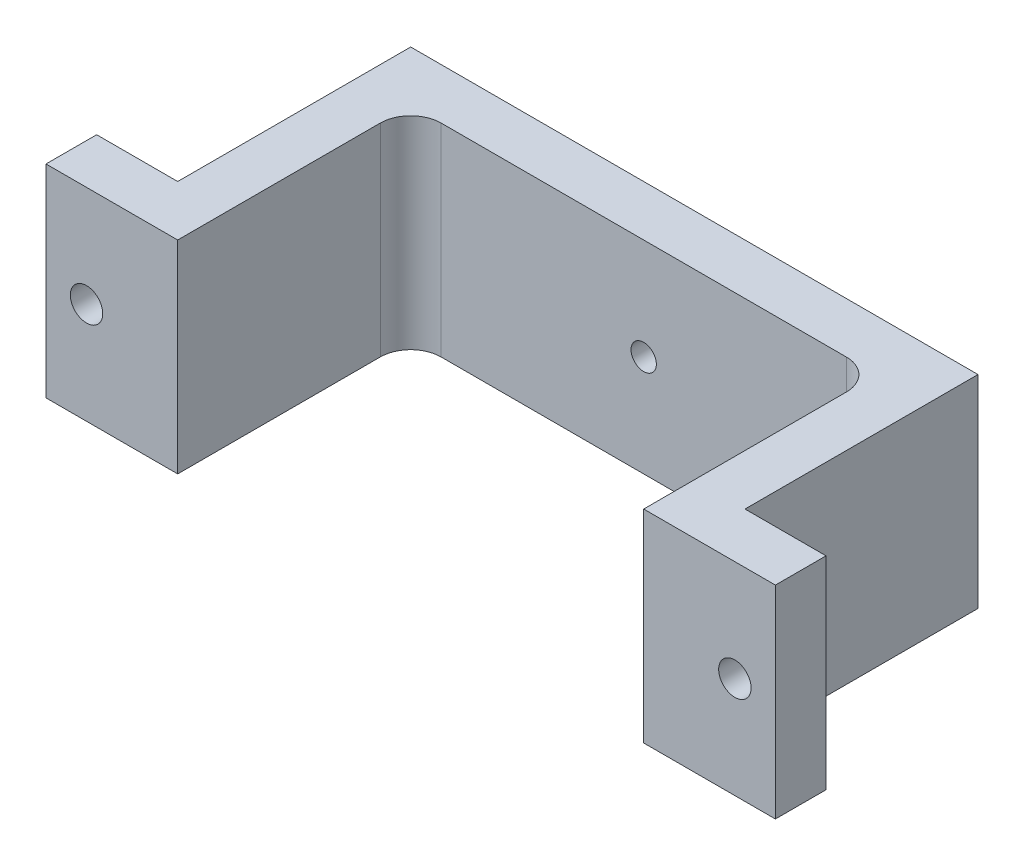
ISO-10303-21;
HEADER;
FILE_DESCRIPTION(('STEP AP214'),'2;1');
FILE_NAME('part.step','',(''),(''),'','','');
FILE_SCHEMA(('AUTOMOTIVE_DESIGN { 1 0 10303 214 1 1 1 1 }'));
ENDSEC;
DATA;
#1=APPLICATION_CONTEXT('core data for automotive mechanical design processes');
#2=APPLICATION_PROTOCOL_DEFINITION('international standard','automotive_design',2000,#1);
#3=PRODUCT_CONTEXT('',#1,'mechanical');
#4=PRODUCT('Part','Part','',(#3));
#5=PRODUCT_RELATED_PRODUCT_CATEGORY('part','',(#4));
#6=PRODUCT_DEFINITION_FORMATION('','',#4);
#7=PRODUCT_DEFINITION_CONTEXT('part definition',#1,'design');
#8=PRODUCT_DEFINITION('design','',#6,#7);
#9=PRODUCT_DEFINITION_SHAPE('','',#8);
#10=(LENGTH_UNIT() NAMED_UNIT(*) SI_UNIT(.MILLI.,.METRE.));
#11=(NAMED_UNIT(*) PLANE_ANGLE_UNIT() SI_UNIT($,.RADIAN.));
#12=(NAMED_UNIT(*) SI_UNIT($,.STERADIAN.) SOLID_ANGLE_UNIT());
#13=UNCERTAINTY_MEASURE_WITH_UNIT(LENGTH_MEASURE(1.E-05),#10,'distance_accuracy_value','');
#14=(GEOMETRIC_REPRESENTATION_CONTEXT(3) GLOBAL_UNCERTAINTY_ASSIGNED_CONTEXT((#13)) GLOBAL_UNIT_ASSIGNED_CONTEXT((#10,
#11,#12)) REPRESENTATION_CONTEXT('',''));
#15=CARTESIAN_POINT('',(0.,0.,0.));
#16=DIRECTION('',(0.,0.,1.));
#17=DIRECTION('',(1.,0.,0.));
#18=AXIS2_PLACEMENT_3D('',#15,#16,#17);
#19=CARTESIAN_POINT('',(23.,20.,15.4715540863816));
#20=DIRECTION('',(1.,0.,0.));
#21=DIRECTION('',(0.,0.,-1.));
#22=AXIS2_PLACEMENT_3D('',#19,#20,#21);
#23=PLANE('',#22);
#24=DIRECTION('',(0.,0.,1.));
#25=VECTOR('',#24,1.);
#26=CARTESIAN_POINT('',(23.,20.,15.4715540863816));
#27=LINE('',#26,#25);
#28=CARTESIAN_POINT('',(23.,20.,-4.52844591361837));
#29=VERTEX_POINT('',#28);
#30=CARTESIAN_POINT('',(23.,20.,15.4715540863816));
#31=VERTEX_POINT('',#30);
#32=EDGE_CURVE('E146',#29,#31,#27,.T.);
#33=ORIENTED_EDGE('',*,*,#32,.F.);
#34=DIRECTION('',(0.,-1.,0.));
#35=VECTOR('',#34,1.);
#36=CARTESIAN_POINT('',(23.,0.,-4.52844591361837));
#37=LINE('',#36,#35);
#38=CARTESIAN_POINT('',(23.,0.,-4.52844591361837));
#39=VERTEX_POINT('',#38);
#40=EDGE_CURVE('E175',#29,#39,#37,.T.);
#41=ORIENTED_EDGE('',*,*,#40,.T.);
#42=DIRECTION('',(0.,0.,1.));
#43=VECTOR('',#42,1.);
#44=CARTESIAN_POINT('',(23.,0.,15.4715540863816));
#45=LINE('',#44,#43);
#46=CARTESIAN_POINT('',(23.,0.,15.4715540863816));
#47=VERTEX_POINT('',#46);
#48=EDGE_CURVE('E172',#39,#47,#45,.T.);
#49=ORIENTED_EDGE('',*,*,#48,.T.);
#50=DIRECTION('',(0.,-1.,0.));
#51=VECTOR('',#50,1.);
#52=CARTESIAN_POINT('',(23.,20.,15.4715540863816));
#53=LINE('',#52,#51);
#54=EDGE_CURVE('E164',#31,#47,#53,.T.);
#55=ORIENTED_EDGE('',*,*,#54,.F.);
#56=EDGE_LOOP('',(#33,#41,#49,#55));
#57=FACE_BOUND('',#56,.T.);
#58=ADVANCED_FACE('F45',(#57),#23,.F.);
#59=CARTESIAN_POINT('',(36.,20.,15.4715540863816));
#60=DIRECTION('',(0.,0.,-1.));
#61=DIRECTION('',(-1.,0.,0.));
#62=AXIS2_PLACEMENT_3D('',#59,#60,#61);
#63=PLANE('',#62);
#64=CARTESIAN_POINT('',(32.,10.,15.4715540863816));
#65=DIRECTION('',(0.,0.,1.));
#66=DIRECTION('',(1.,0.,0.));
#67=AXIS2_PLACEMENT_3D('',#64,#65,#66);
#68=CIRCLE('',#67,1.6);
#69=CARTESIAN_POINT('',(33.6,10.,15.4715540863816));
#70=VERTEX_POINT('',#69);
#71=EDGE_CURVE('E291',#70,#70,#68,.T.);
#72=ORIENTED_EDGE('',*,*,#71,.F.);
#73=EDGE_LOOP('',(#72));
#74=FACE_BOUND('',#73,.T.);
#75=DIRECTION('',(1.,0.,0.));
#76=VECTOR('',#75,1.);
#77=CARTESIAN_POINT('',(36.,0.,15.4715540863816));
#78=LINE('',#77,#76);
#79=CARTESIAN_POINT('',(36.,0.,15.4715540863816));
#80=VERTEX_POINT('',#79);
#81=EDGE_CURVE('E338',#47,#80,#78,.T.);
#82=ORIENTED_EDGE('',*,*,#81,.T.);
#83=DIRECTION('',(0.,-1.,0.));
#84=VECTOR('',#83,1.);
#85=CARTESIAN_POINT('',(36.,20.,15.4715540863816));
#86=LINE('',#85,#84);
#87=CARTESIAN_POINT('',(36.,20.,15.4715540863816));
#88=VERTEX_POINT('',#87);
#89=EDGE_CURVE('E166',#88,#80,#86,.T.);
#90=ORIENTED_EDGE('',*,*,#89,.F.);
#91=DIRECTION('',(1.,0.,0.));
#92=VECTOR('',#91,1.);
#93=CARTESIAN_POINT('',(36.,20.,15.4715540863816));
#94=LINE('',#93,#92);
#95=EDGE_CURVE('E150',#31,#88,#94,.T.);
#96=ORIENTED_EDGE('',*,*,#95,.F.);
#97=ORIENTED_EDGE('',*,*,#54,.T.);
#98=EDGE_LOOP('',(#82,#90,#96,#97));
#99=FACE_BOUND('',#98,.T.);
#100=ADVANCED_FACE('F163',(#74,#99),#63,.F.);
#101=CARTESIAN_POINT('',(36.,20.,10.4715540863816));
#102=DIRECTION('',(-1.,0.,0.));
#103=DIRECTION('',(0.,0.,1.));
#104=AXIS2_PLACEMENT_3D('',#101,#102,#103);
#105=PLANE('',#104);
#106=DIRECTION('',(0.,0.,-1.));
#107=VECTOR('',#106,1.);
#108=CARTESIAN_POINT('',(36.,0.,10.4715540863816));
#109=LINE('',#108,#107);
#110=CARTESIAN_POINT('',(36.,0.,10.4715540863816));
#111=VERTEX_POINT('',#110);
#112=EDGE_CURVE('E341',#80,#111,#109,.T.);
#113=ORIENTED_EDGE('',*,*,#112,.T.);
#114=DIRECTION('',(0.,-1.,0.));
#115=VECTOR('',#114,1.);
#116=CARTESIAN_POINT('',(36.,20.,10.4715540863816));
#117=LINE('',#116,#115);
#118=CARTESIAN_POINT('',(36.,20.,10.4715540863816));
#119=VERTEX_POINT('',#118);
#120=EDGE_CURVE('E181',#119,#111,#117,.T.);
#121=ORIENTED_EDGE('',*,*,#120,.F.);
#122=DIRECTION('',(0.,0.,-1.));
#123=VECTOR('',#122,1.);
#124=CARTESIAN_POINT('',(36.,20.,10.4715540863816));
#125=LINE('',#124,#123);
#126=EDGE_CURVE('E169',#88,#119,#125,.T.);
#127=ORIENTED_EDGE('',*,*,#126,.F.);
#128=ORIENTED_EDGE('',*,*,#89,.T.);
#129=EDGE_LOOP('',(#113,#121,#127,#128));
#130=FACE_BOUND('',#129,.T.);
#131=ADVANCED_FACE('F225',(#130),#105,.F.);
#132=CARTESIAN_POINT('',(28.,20.,10.4715540863816));
#133=DIRECTION('',(0.,0.,1.));
#134=DIRECTION('',(1.,0.,0.));
#135=AXIS2_PLACEMENT_3D('',#132,#133,#134);
#136=PLANE('',#135);
#137=CARTESIAN_POINT('',(32.,10.,10.4715540863816));
#138=DIRECTION('',(0.,0.,1.));
#139=DIRECTION('',(1.,0.,0.));
#140=AXIS2_PLACEMENT_3D('',#137,#138,#139);
#141=CIRCLE('',#140,1.6);
#142=CARTESIAN_POINT('',(33.6,10.,10.4715540863816));
#143=VERTEX_POINT('',#142);
#144=EDGE_CURVE('E286',#143,#143,#141,.F.);
#145=ORIENTED_EDGE('',*,*,#144,.F.);
#146=EDGE_LOOP('',(#145));
#147=FACE_BOUND('',#146,.T.);
#148=DIRECTION('',(-1.,0.,0.));
#149=VECTOR('',#148,1.);
#150=CARTESIAN_POINT('',(28.,0.,10.4715540863816));
#151=LINE('',#150,#149);
#152=CARTESIAN_POINT('',(28.,0.,10.4715540863816));
#153=VERTEX_POINT('',#152);
#154=EDGE_CURVE('E344',#111,#153,#151,.T.);
#155=ORIENTED_EDGE('',*,*,#154,.T.);
#156=DIRECTION('',(0.,-1.,0.));
#157=VECTOR('',#156,1.);
#158=CARTESIAN_POINT('',(28.,20.,10.4715540863816));
#159=LINE('',#158,#157);
#160=CARTESIAN_POINT('',(28.,20.,10.4715540863816));
#161=VERTEX_POINT('',#160);
#162=EDGE_CURVE('E390',#161,#153,#159,.T.);
#163=ORIENTED_EDGE('',*,*,#162,.F.);
#164=DIRECTION('',(-1.,0.,0.));
#165=VECTOR('',#164,1.);
#166=CARTESIAN_POINT('',(28.,20.,10.4715540863816));
#167=LINE('',#166,#165);
#168=EDGE_CURVE('E308',#119,#161,#167,.T.);
#169=ORIENTED_EDGE('',*,*,#168,.F.);
#170=ORIENTED_EDGE('',*,*,#120,.T.);
#171=EDGE_LOOP('',(#155,#163,#169,#170));
#172=FACE_BOUND('',#171,.T.);
#173=ADVANCED_FACE('F231',(#147,#172),#136,.F.);
#174=CARTESIAN_POINT('',(28.,20.,-12.5284459136184));
#175=DIRECTION('',(-1.,0.,0.));
#176=DIRECTION('',(0.,0.,1.));
#177=AXIS2_PLACEMENT_3D('',#174,#175,#176);
#178=PLANE('',#177);
#179=DIRECTION('',(0.,0.,-1.));
#180=VECTOR('',#179,1.);
#181=CARTESIAN_POINT('',(28.,0.,-12.5284459136184));
#182=LINE('',#181,#180);
#183=CARTESIAN_POINT('',(28.,0.,-12.5284459136184));
#184=VERTEX_POINT('',#183);
#185=EDGE_CURVE('E347',#153,#184,#182,.T.);
#186=ORIENTED_EDGE('',*,*,#185,.T.);
#187=DIRECTION('',(0.,-1.,0.));
#188=VECTOR('',#187,1.);
#189=CARTESIAN_POINT('',(28.,20.,-12.5284459136184));
#190=LINE('',#189,#188);
#191=CARTESIAN_POINT('',(28.,20.,-12.5284459136184));
#192=VERTEX_POINT('',#191);
#193=EDGE_CURVE('E386',#192,#184,#190,.T.);
#194=ORIENTED_EDGE('',*,*,#193,.F.);
#195=DIRECTION('',(0.,0.,-1.));
#196=VECTOR('',#195,1.);
#197=CARTESIAN_POINT('',(28.,20.,-12.5284459136184));
#198=LINE('',#197,#196);
#199=EDGE_CURVE('E311',#161,#192,#198,.T.);
#200=ORIENTED_EDGE('',*,*,#199,.F.);
#201=ORIENTED_EDGE('',*,*,#162,.T.);
#202=EDGE_LOOP('',(#186,#194,#200,#201));
#203=FACE_BOUND('',#202,.T.);
#204=ADVANCED_FACE('F235',(#203),#178,.F.);
#205=CARTESIAN_POINT('',(28.,20.,-12.5284459136184));
#206=DIRECTION('',(0.,0.,1.));
#207=DIRECTION('',(1.,0.,0.));
#208=AXIS2_PLACEMENT_3D('',#205,#206,#207);
#209=PLANE('',#208);
#210=CARTESIAN_POINT('',(0.,10.,-12.5284459136184));
#211=DIRECTION('',(0.,0.,-1.));
#212=DIRECTION('',(-1.,0.,0.));
#213=AXIS2_PLACEMENT_3D('',#210,#211,#212);
#214=CIRCLE('',#213,1.25);
#215=CARTESIAN_POINT('',(-1.25,10.,-12.5284459136184));
#216=VERTEX_POINT('',#215);
#217=EDGE_CURVE('E281',#216,#216,#214,.T.);
#218=ORIENTED_EDGE('',*,*,#217,.F.);
#219=EDGE_LOOP('',(#218));
#220=FACE_BOUND('',#219,.T.);
#221=DIRECTION('',(-1.,0.,0.));
#222=VECTOR('',#221,1.);
#223=CARTESIAN_POINT('',(28.,0.,-12.5284459136184));
#224=LINE('',#223,#222);
#225=CARTESIAN_POINT('',(-28.,0.,-12.5284459136184));
#226=VERTEX_POINT('',#225);
#227=EDGE_CURVE('E350',#184,#226,#224,.T.);
#228=ORIENTED_EDGE('',*,*,#227,.T.);
#229=DIRECTION('',(0.,-1.,0.));
#230=VECTOR('',#229,1.);
#231=CARTESIAN_POINT('',(-28.,20.,-12.5284459136184));
#232=LINE('',#231,#230);
#233=CARTESIAN_POINT('',(-28.,20.,-12.5284459136184));
#234=VERTEX_POINT('',#233);
#235=EDGE_CURVE('E382',#234,#226,#232,.T.);
#236=ORIENTED_EDGE('',*,*,#235,.F.);
#237=DIRECTION('',(-1.,0.,0.));
#238=VECTOR('',#237,1.);
#239=CARTESIAN_POINT('',(28.,20.,-12.5284459136184));
#240=LINE('',#239,#238);
#241=EDGE_CURVE('E314',#192,#234,#240,.T.);
#242=ORIENTED_EDGE('',*,*,#241,.F.);
#243=ORIENTED_EDGE('',*,*,#193,.T.);
#244=EDGE_LOOP('',(#228,#236,#242,#243));
#245=FACE_BOUND('',#244,.T.);
#246=ADVANCED_FACE('F239',(#220,#245),#209,.F.);
#247=CARTESIAN_POINT('',(-28.,20.,-12.5284459136184));
#248=DIRECTION('',(1.,0.,0.));
#249=DIRECTION('',(0.,0.,-1.));
#250=AXIS2_PLACEMENT_3D('',#247,#248,#249);
#251=PLANE('',#250);
#252=DIRECTION('',(0.,0.,1.));
#253=VECTOR('',#252,1.);
#254=CARTESIAN_POINT('',(-28.,0.,-12.5284459136184));
#255=LINE('',#254,#253);
#256=CARTESIAN_POINT('',(-28.,0.,10.4715540863816));
#257=VERTEX_POINT('',#256);
#258=EDGE_CURVE('E353',#226,#257,#255,.T.);
#259=ORIENTED_EDGE('',*,*,#258,.T.);
#260=DIRECTION('',(0.,-1.,0.));
#261=VECTOR('',#260,1.);
#262=CARTESIAN_POINT('',(-28.,20.,10.4715540863816));
#263=LINE('',#262,#261);
#264=CARTESIAN_POINT('',(-28.,20.,10.4715540863816));
#265=VERTEX_POINT('',#264);
#266=EDGE_CURVE('E378',#265,#257,#263,.T.);
#267=ORIENTED_EDGE('',*,*,#266,.F.);
#268=DIRECTION('',(0.,0.,1.));
#269=VECTOR('',#268,1.);
#270=CARTESIAN_POINT('',(-28.,20.,-12.5284459136184));
#271=LINE('',#270,#269);
#272=EDGE_CURVE('E317',#234,#265,#271,.T.);
#273=ORIENTED_EDGE('',*,*,#272,.F.);
#274=ORIENTED_EDGE('',*,*,#235,.T.);
#275=EDGE_LOOP('',(#259,#267,#273,#274));
#276=FACE_BOUND('',#275,.T.);
#277=ADVANCED_FACE('F243',(#276),#251,.F.);
#278=CARTESIAN_POINT('',(-28.,20.,10.4715540863816));
#279=DIRECTION('',(0.,0.,1.));
#280=DIRECTION('',(1.,0.,0.));
#281=AXIS2_PLACEMENT_3D('',#278,#279,#280);
#282=PLANE('',#281);
#283=CARTESIAN_POINT('',(-32.,10.,10.4715540863816));
#284=DIRECTION('',(0.,0.,1.));
#285=DIRECTION('',(1.,0.,0.));
#286=AXIS2_PLACEMENT_3D('',#283,#284,#285);
#287=CIRCLE('',#286,1.6);
#288=CARTESIAN_POINT('',(-30.4,10.,10.4715540863816));
#289=VERTEX_POINT('',#288);
#290=EDGE_CURVE('E299',#289,#289,#287,.F.);
#291=ORIENTED_EDGE('',*,*,#290,.F.);
#292=EDGE_LOOP('',(#291));
#293=FACE_BOUND('',#292,.T.);
#294=DIRECTION('',(-1.,0.,0.));
#295=VECTOR('',#294,1.);
#296=CARTESIAN_POINT('',(-28.,0.,10.4715540863816));
#297=LINE('',#296,#295);
#298=CARTESIAN_POINT('',(-36.,0.,10.4715540863816));
#299=VERTEX_POINT('',#298);
#300=EDGE_CURVE('E356',#257,#299,#297,.T.);
#301=ORIENTED_EDGE('',*,*,#300,.T.);
#302=DIRECTION('',(0.,-1.,0.));
#303=VECTOR('',#302,1.);
#304=CARTESIAN_POINT('',(-36.,20.,10.4715540863816));
#305=LINE('',#304,#303);
#306=CARTESIAN_POINT('',(-36.,20.,10.4715540863816));
#307=VERTEX_POINT('',#306);
#308=EDGE_CURVE('E374',#307,#299,#305,.T.);
#309=ORIENTED_EDGE('',*,*,#308,.F.);
#310=DIRECTION('',(-1.,0.,0.));
#311=VECTOR('',#310,1.);
#312=CARTESIAN_POINT('',(-28.,20.,10.4715540863816));
#313=LINE('',#312,#311);
#314=EDGE_CURVE('E320',#265,#307,#313,.T.);
#315=ORIENTED_EDGE('',*,*,#314,.F.);
#316=ORIENTED_EDGE('',*,*,#266,.T.);
#317=EDGE_LOOP('',(#301,#309,#315,#316));
#318=FACE_BOUND('',#317,.T.);
#319=ADVANCED_FACE('F247',(#293,#318),#282,.F.);
#320=CARTESIAN_POINT('',(-36.,20.,10.4715540863816));
#321=DIRECTION('',(1.,0.,0.));
#322=DIRECTION('',(0.,0.,-1.));
#323=AXIS2_PLACEMENT_3D('',#320,#321,#322);
#324=PLANE('',#323);
#325=DIRECTION('',(0.,0.,1.));
#326=VECTOR('',#325,1.);
#327=CARTESIAN_POINT('',(-36.,0.,10.4715540863816));
#328=LINE('',#327,#326);
#329=CARTESIAN_POINT('',(-36.,0.,15.4715540863816));
#330=VERTEX_POINT('',#329);
#331=EDGE_CURVE('E359',#299,#330,#328,.T.);
#332=ORIENTED_EDGE('',*,*,#331,.T.);
#333=DIRECTION('',(0.,-1.,0.));
#334=VECTOR('',#333,1.);
#335=CARTESIAN_POINT('',(-36.,20.,15.4715540863816));
#336=LINE('',#335,#334);
#337=CARTESIAN_POINT('',(-36.,20.,15.4715540863816));
#338=VERTEX_POINT('',#337);
#339=EDGE_CURVE('E370',#338,#330,#336,.T.);
#340=ORIENTED_EDGE('',*,*,#339,.F.);
#341=DIRECTION('',(0.,0.,1.));
#342=VECTOR('',#341,1.);
#343=CARTESIAN_POINT('',(-36.,20.,10.4715540863816));
#344=LINE('',#343,#342);
#345=EDGE_CURVE('E323',#307,#338,#344,.T.);
#346=ORIENTED_EDGE('',*,*,#345,.F.);
#347=ORIENTED_EDGE('',*,*,#308,.T.);
#348=EDGE_LOOP('',(#332,#340,#346,#347));
#349=FACE_BOUND('',#348,.T.);
#350=ADVANCED_FACE('F251',(#349),#324,.F.);
#351=CARTESIAN_POINT('',(-36.,20.,15.4715540863816));
#352=DIRECTION('',(0.,0.,-1.));
#353=DIRECTION('',(-1.,0.,0.));
#354=AXIS2_PLACEMENT_3D('',#351,#352,#353);
#355=PLANE('',#354);
#356=CARTESIAN_POINT('',(-32.,10.,15.4715540863816));
#357=DIRECTION('',(0.,0.,1.));
#358=DIRECTION('',(1.,0.,0.));
#359=AXIS2_PLACEMENT_3D('',#356,#357,#358);
#360=CIRCLE('',#359,1.6);
#361=CARTESIAN_POINT('',(-30.4,10.,15.4715540863816));
#362=VERTEX_POINT('',#361);
#363=EDGE_CURVE('E295',#362,#362,#360,.T.);
#364=ORIENTED_EDGE('',*,*,#363,.F.);
#365=EDGE_LOOP('',(#364));
#366=FACE_BOUND('',#365,.T.);
#367=DIRECTION('',(1.,0.,0.));
#368=VECTOR('',#367,1.);
#369=CARTESIAN_POINT('',(-36.,0.,15.4715540863816));
#370=LINE('',#369,#368);
#371=CARTESIAN_POINT('',(-23.,0.,15.4715540863816));
#372=VERTEX_POINT('',#371);
#373=EDGE_CURVE('E362',#330,#372,#370,.T.);
#374=ORIENTED_EDGE('',*,*,#373,.T.);
#375=DIRECTION('',(0.,-1.,0.));
#376=VECTOR('',#375,1.);
#377=CARTESIAN_POINT('',(-23.,20.,15.4715540863816));
#378=LINE('',#377,#376);
#379=CARTESIAN_POINT('',(-23.,20.,15.4715540863816));
#380=VERTEX_POINT('',#379);
#381=EDGE_CURVE('E335',#380,#372,#378,.T.);
#382=ORIENTED_EDGE('',*,*,#381,.F.);
#383=DIRECTION('',(1.,0.,0.));
#384=VECTOR('',#383,1.);
#385=CARTESIAN_POINT('',(-36.,20.,15.4715540863816));
#386=LINE('',#385,#384);
#387=EDGE_CURVE('E326',#338,#380,#386,.T.);
#388=ORIENTED_EDGE('',*,*,#387,.F.);
#389=ORIENTED_EDGE('',*,*,#339,.T.);
#390=EDGE_LOOP('',(#374,#382,#388,#389));
#391=FACE_BOUND('',#390,.T.);
#392=ADVANCED_FACE('F254',(#366,#391),#355,.F.);
#393=CARTESIAN_POINT('',(-23.,20.,15.4715540863816));
#394=DIRECTION('',(-1.,0.,0.));
#395=DIRECTION('',(0.,0.,1.));
#396=AXIS2_PLACEMENT_3D('',#393,#394,#395);
#397=PLANE('',#396);
#398=DIRECTION('',(0.,0.,-1.));
#399=VECTOR('',#398,1.);
#400=CARTESIAN_POINT('',(-23.,0.,15.4715540863816));
#401=LINE('',#400,#399);
#402=CARTESIAN_POINT('',(-23.,0.,-4.52844591361837));
#403=VERTEX_POINT('',#402);
#404=EDGE_CURVE('E207',#372,#403,#401,.T.);
#405=ORIENTED_EDGE('',*,*,#404,.T.);
#406=DIRECTION('',(0.,-1.,0.));
#407=VECTOR('',#406,1.);
#408=CARTESIAN_POINT('',(-23.,20.,-4.52844591361837));
#409=LINE('',#408,#407);
#410=CARTESIAN_POINT('',(-23.,20.,-4.52844591361837));
#411=VERTEX_POINT('',#410);
#412=EDGE_CURVE('E61',#403,#411,#409,.F.);
#413=ORIENTED_EDGE('',*,*,#412,.T.);
#414=DIRECTION('',(0.,0.,-1.));
#415=VECTOR('',#414,1.);
#416=CARTESIAN_POINT('',(-23.,20.,15.4715540863816));
#417=LINE('',#416,#415);
#418=EDGE_CURVE('E329',#380,#411,#417,.T.);
#419=ORIENTED_EDGE('',*,*,#418,.F.);
#420=ORIENTED_EDGE('',*,*,#381,.T.);
#421=EDGE_LOOP('',(#405,#413,#419,#420));
#422=FACE_BOUND('',#421,.T.);
#423=ADVANCED_FACE('F258',(#422),#397,.F.);
#424=CARTESIAN_POINT('',(-23.,20.,-7.52844591361837));
#425=DIRECTION('',(0.,0.,-1.));
#426=DIRECTION('',(-1.,0.,0.));
#427=AXIS2_PLACEMENT_3D('',#424,#425,#426);
#428=PLANE('',#427);
#429=CARTESIAN_POINT('',(0.,10.,-7.52844591361837));
#430=DIRECTION('',(0.,0.,-1.));
#431=DIRECTION('',(-1.,0.,0.));
#432=AXIS2_PLACEMENT_3D('',#429,#430,#431);
#433=CIRCLE('',#432,1.25);
#434=CARTESIAN_POINT('',(-1.25,10.,-7.52844591361837));
#435=VERTEX_POINT('',#434);
#436=EDGE_CURVE('E284',#435,#435,#433,.F.);
#437=ORIENTED_EDGE('',*,*,#436,.F.);
#438=EDGE_LOOP('',(#437));
#439=FACE_BOUND('',#438,.T.);
#440=DIRECTION('',(1.,0.,0.));
#441=VECTOR('',#440,1.);
#442=CARTESIAN_POINT('',(-23.,0.,-7.52844591361837));
#443=LINE('',#442,#441);
#444=CARTESIAN_POINT('',(-20.,0.,-7.52844591361837));
#445=VERTEX_POINT('',#444);
#446=CARTESIAN_POINT('',(20.,0.,-7.52844591361837));
#447=VERTEX_POINT('',#446);
#448=EDGE_CURVE('E159',#445,#447,#443,.T.);
#449=ORIENTED_EDGE('',*,*,#448,.T.);
#450=DIRECTION('',(0.,-1.,0.));
#451=VECTOR('',#450,1.);
#452=CARTESIAN_POINT('',(20.,20.,-7.52844591361837));
#453=LINE('',#452,#451);
#454=CARTESIAN_POINT('',(20.,20.,-7.52844591361837));
#455=VERTEX_POINT('',#454);
#456=EDGE_CURVE('E188',#447,#455,#453,.F.);
#457=ORIENTED_EDGE('',*,*,#456,.T.);
#458=DIRECTION('',(1.,0.,0.));
#459=VECTOR('',#458,1.);
#460=CARTESIAN_POINT('',(-23.,20.,-7.52844591361837));
#461=LINE('',#460,#459);
#462=CARTESIAN_POINT('',(-20.,20.,-7.52844591361837));
#463=VERTEX_POINT('',#462);
#464=EDGE_CURVE('E332',#463,#455,#461,.T.);
#465=ORIENTED_EDGE('',*,*,#464,.F.);
#466=DIRECTION('',(0.,-1.,0.));
#467=VECTOR('',#466,1.);
#468=CARTESIAN_POINT('',(-20.,0.,-7.52844591361837));
#469=LINE('',#468,#467);
#470=EDGE_CURVE('E179',#463,#445,#469,.T.);
#471=ORIENTED_EDGE('',*,*,#470,.T.);
#472=EDGE_LOOP('',(#449,#457,#465,#471));
#473=FACE_BOUND('',#472,.T.);
#474=ADVANCED_FACE('F203',(#439,#473),#428,.F.);
#475=CARTESIAN_POINT('',(0.,20.,0.));
#476=DIRECTION('',(0.,-1.,0.));
#477=DIRECTION('',(0.,0.,-1.));
#478=AXIS2_PLACEMENT_3D('',#475,#476,#477);
#479=PLANE('',#478);
#480=ORIENTED_EDGE('',*,*,#464,.T.);
#481=CARTESIAN_POINT('',(20.,20.,-4.52844591361837));
#482=DIRECTION('',(0.,-1.,0.));
#483=DIRECTION('',(0.,0.,-1.));
#484=AXIS2_PLACEMENT_3D('',#481,#482,#483);
#485=CIRCLE('',#484,3.);
#486=EDGE_CURVE('E153',#455,#29,#485,.T.);
#487=ORIENTED_EDGE('',*,*,#486,.T.);
#488=ORIENTED_EDGE('',*,*,#32,.T.);
#489=ORIENTED_EDGE('',*,*,#95,.T.);
#490=ORIENTED_EDGE('',*,*,#126,.T.);
#491=ORIENTED_EDGE('',*,*,#168,.T.);
#492=ORIENTED_EDGE('',*,*,#199,.T.);
#493=ORIENTED_EDGE('',*,*,#241,.T.);
#494=ORIENTED_EDGE('',*,*,#272,.T.);
#495=ORIENTED_EDGE('',*,*,#314,.T.);
#496=ORIENTED_EDGE('',*,*,#345,.T.);
#497=ORIENTED_EDGE('',*,*,#387,.T.);
#498=ORIENTED_EDGE('',*,*,#418,.T.);
#499=CARTESIAN_POINT('',(-20.,20.,-4.52844591361837));
#500=DIRECTION('',(0.,-1.,0.));
#501=DIRECTION('',(0.,0.,-1.));
#502=AXIS2_PLACEMENT_3D('',#499,#500,#501);
#503=CIRCLE('',#502,3.);
#504=EDGE_CURVE('E11',#411,#463,#503,.T.);
#505=ORIENTED_EDGE('',*,*,#504,.T.);
#506=EDGE_LOOP('',(#480,#487,#488,#489,#490,#491,#492,#493,#494,#495,#496,#497,#498,#505));
#507=FACE_BOUND('',#506,.T.);
#508=ADVANCED_FACE('F149',(#507),#479,.F.);
#509=CARTESIAN_POINT('',(0.,0.,0.));
#510=DIRECTION('',(0.,-1.,0.));
#511=DIRECTION('',(0.,0.,-1.));
#512=AXIS2_PLACEMENT_3D('',#509,#510,#511);
#513=PLANE('',#512);
#514=ORIENTED_EDGE('',*,*,#48,.F.);
#515=CARTESIAN_POINT('',(20.,0.,-4.52844591361837));
#516=DIRECTION('',(0.,-1.,0.));
#517=DIRECTION('',(0.,0.,-1.));
#518=AXIS2_PLACEMENT_3D('',#515,#516,#517);
#519=CIRCLE('',#518,3.);
#520=EDGE_CURVE('E193',#39,#447,#519,.F.);
#521=ORIENTED_EDGE('',*,*,#520,.T.);
#522=ORIENTED_EDGE('',*,*,#448,.F.);
#523=CARTESIAN_POINT('',(-20.,0.,-4.52844591361837));
#524=DIRECTION('',(0.,-1.,0.));
#525=DIRECTION('',(0.,0.,-1.));
#526=AXIS2_PLACEMENT_3D('',#523,#524,#525);
#527=CIRCLE('',#526,3.);
#528=EDGE_CURVE('E54',#445,#403,#527,.F.);
#529=ORIENTED_EDGE('',*,*,#528,.T.);
#530=ORIENTED_EDGE('',*,*,#404,.F.);
#531=ORIENTED_EDGE('',*,*,#373,.F.);
#532=ORIENTED_EDGE('',*,*,#331,.F.);
#533=ORIENTED_EDGE('',*,*,#300,.F.);
#534=ORIENTED_EDGE('',*,*,#258,.F.);
#535=ORIENTED_EDGE('',*,*,#227,.F.);
#536=ORIENTED_EDGE('',*,*,#185,.F.);
#537=ORIENTED_EDGE('',*,*,#154,.F.);
#538=ORIENTED_EDGE('',*,*,#112,.F.);
#539=ORIENTED_EDGE('',*,*,#81,.F.);
#540=EDGE_LOOP('',(#514,#521,#522,#529,#530,#531,#532,#533,#534,#535,#536,#537,#538,#539));
#541=FACE_BOUND('',#540,.T.);
#542=ADVANCED_FACE('F199',(#541),#513,.T.);
#543=CARTESIAN_POINT('',(20.,20.,-4.52844591361837));
#544=DIRECTION('',(0.,1.,0.));
#545=DIRECTION('',(0.,0.,1.));
#546=AXIS2_PLACEMENT_3D('',#543,#544,#545);
#547=CYLINDRICAL_SURFACE('',#546,3.);
#548=ORIENTED_EDGE('',*,*,#486,.F.);
#549=ORIENTED_EDGE('',*,*,#456,.F.);
#550=ORIENTED_EDGE('',*,*,#520,.F.);
#551=ORIENTED_EDGE('',*,*,#40,.F.);
#552=EDGE_LOOP('',(#548,#549,#550,#551));
#553=FACE_BOUND('',#552,.T.);
#554=ADVANCED_FACE('F209',(#553),#547,.F.);
#555=CARTESIAN_POINT('',(-20.,20.,-4.52844591361837));
#556=DIRECTION('',(0.,1.,0.));
#557=DIRECTION('',(0.,0.,1.));
#558=AXIS2_PLACEMENT_3D('',#555,#556,#557);
#559=CYLINDRICAL_SURFACE('',#558,3.);
#560=ORIENTED_EDGE('',*,*,#504,.F.);
#561=ORIENTED_EDGE('',*,*,#412,.F.);
#562=ORIENTED_EDGE('',*,*,#528,.F.);
#563=ORIENTED_EDGE('',*,*,#470,.F.);
#564=EDGE_LOOP('',(#560,#561,#562,#563));
#565=FACE_BOUND('',#564,.T.);
#566=ADVANCED_FACE('F47',(#565),#559,.F.);
#567=CARTESIAN_POINT('',(-32.,10.,-12.5294459136184));
#568=DIRECTION('',(0.,0.,1.));
#569=DIRECTION('',(1.,0.,0.));
#570=AXIS2_PLACEMENT_3D('',#567,#568,#569);
#571=CYLINDRICAL_SURFACE('',#570,1.6);
#572=CARTESIAN_POINT('',(-30.4,10.,15.4715540863816));
#573=CARTESIAN_POINT('',(-30.4,10.,15.4194707530483));
#574=CARTESIAN_POINT('',(-30.4,10.,15.367387419715));
#575=CARTESIAN_POINT('',(-30.4,10.,15.2632207530483));
#576=CARTESIAN_POINT('',(-30.4,10.,15.211137419715));
#577=CARTESIAN_POINT('',(-30.4,10.,15.1069707530483));
#578=CARTESIAN_POINT('',(-30.4,10.,15.054887419715));
#579=CARTESIAN_POINT('',(-30.4,10.,14.9507207530483));
#580=CARTESIAN_POINT('',(-30.4,10.,14.898637419715));
#581=CARTESIAN_POINT('',(-30.4,10.,14.7944707530483));
#582=CARTESIAN_POINT('',(-30.4,10.,14.742387419715));
#583=CARTESIAN_POINT('',(-30.4,10.,14.6382207530483));
#584=CARTESIAN_POINT('',(-30.4,10.,14.586137419715));
#585=CARTESIAN_POINT('',(-30.4,10.,14.4819707530483));
#586=CARTESIAN_POINT('',(-30.4,10.,14.429887419715));
#587=CARTESIAN_POINT('',(-30.4,10.,14.3257207530483));
#588=CARTESIAN_POINT('',(-30.4,10.,14.273637419715));
#589=CARTESIAN_POINT('',(-30.4,10.,14.1694707530483));
#590=CARTESIAN_POINT('',(-30.4,10.,14.117387419715));
#591=CARTESIAN_POINT('',(-30.4,10.,14.0132207530483));
#592=CARTESIAN_POINT('',(-30.4,10.,13.961137419715));
#593=CARTESIAN_POINT('',(-30.4,10.,13.8569707530483));
#594=CARTESIAN_POINT('',(-30.4,10.,13.804887419715));
#595=CARTESIAN_POINT('',(-30.4,10.,13.7007207530483));
#596=CARTESIAN_POINT('',(-30.4,10.,13.648637419715));
#597=CARTESIAN_POINT('',(-30.4,10.,13.5444707530483));
#598=CARTESIAN_POINT('',(-30.4,10.,13.492387419715));
#599=CARTESIAN_POINT('',(-30.4,10.,13.3882207530483));
#600=CARTESIAN_POINT('',(-30.4,10.,13.336137419715));
#601=CARTESIAN_POINT('',(-30.4,10.,13.2319707530483));
#602=CARTESIAN_POINT('',(-30.4,10.,13.179887419715));
#603=CARTESIAN_POINT('',(-30.4,10.,13.0757207530483));
#604=CARTESIAN_POINT('',(-30.4,10.,13.023637419715));
#605=CARTESIAN_POINT('',(-30.4,10.,12.9194707530483));
#606=CARTESIAN_POINT('',(-30.4,10.,12.867387419715));
#607=CARTESIAN_POINT('',(-30.4,10.,12.7632207530483));
#608=CARTESIAN_POINT('',(-30.4,10.,12.711137419715));
#609=CARTESIAN_POINT('',(-30.4,10.,12.6069707530483));
#610=CARTESIAN_POINT('',(-30.4,10.,12.554887419715));
#611=CARTESIAN_POINT('',(-30.4,10.,12.4507207530483));
#612=CARTESIAN_POINT('',(-30.4,10.,12.398637419715));
#613=CARTESIAN_POINT('',(-30.4,10.,12.2944707530483));
#614=CARTESIAN_POINT('',(-30.4,10.,12.242387419715));
#615=CARTESIAN_POINT('',(-30.4,10.,12.1382207530483));
#616=CARTESIAN_POINT('',(-30.4,10.,12.086137419715));
#617=CARTESIAN_POINT('',(-30.4,10.,11.9819707530483));
#618=CARTESIAN_POINT('',(-30.4,10.,11.929887419715));
#619=CARTESIAN_POINT('',(-30.4,10.,11.8257207530483));
#620=CARTESIAN_POINT('',(-30.4,10.,11.773637419715));
#621=CARTESIAN_POINT('',(-30.4,10.,11.6694707530483));
#622=CARTESIAN_POINT('',(-30.4,10.,11.617387419715));
#623=CARTESIAN_POINT('',(-30.4,10.,11.5132207530483));
#624=CARTESIAN_POINT('',(-30.4,10.,11.461137419715));
#625=CARTESIAN_POINT('',(-30.4,10.,11.3569707530483));
#626=CARTESIAN_POINT('',(-30.4,10.,11.304887419715));
#627=CARTESIAN_POINT('',(-30.4,10.,11.2007207530483));
#628=CARTESIAN_POINT('',(-30.4,10.,11.148637419715));
#629=CARTESIAN_POINT('',(-30.4,10.,11.0444707530483));
#630=CARTESIAN_POINT('',(-30.4,10.,10.992387419715));
#631=CARTESIAN_POINT('',(-30.4,10.,10.8882207530483));
#632=CARTESIAN_POINT('',(-30.4,10.,10.836137419715));
#633=CARTESIAN_POINT('',(-30.4,10.,10.7319707530483));
#634=CARTESIAN_POINT('',(-30.4,10.,10.679887419715));
#635=CARTESIAN_POINT('',(-30.4,10.,10.5757207530483));
#636=CARTESIAN_POINT('',(-30.4,10.,10.523637419715));
#637=CARTESIAN_POINT('',(-30.4,10.,10.4715540863816));
#638=B_SPLINE_CURVE_WITH_KNOTS('',3,(#572,#573,#574,#575,#576,#577,#578,#579,#580,#581,#582,
#583,#584,#585,#586,#587,#588,#589,#590,#591,#592,#593,#594,#595,#596,#597,#598,#599,#600,#601,
#602,#603,#604,#605,#606,#607,#608,#609,#610,#611,#612,#613,#614,#615,#616,#617,#618,#619,#620,
#621,#622,#623,#624,#625,#626,#627,#628,#629,#630,#631,#632,#633,#634,#635,#636,#637),
.UNSPECIFIED.,.F.,.F.,(4,2,2,2,2,2,2,2,2,2,2,2,2,2,2,2,2,2,2,2,2,2,2,2,2,2,2,2,2,2,2,2,4),(0.,
0.15625,0.3125,0.46875,0.625000000000001,0.781250000000001,0.937500000000001,1.09375,1.25,
1.40625,1.5625,1.71875,1.875,2.03125,2.1875,2.34375,2.5,2.65625,2.8125,2.96875,3.125,3.28125,
3.4375,3.59375,3.75,3.90625,4.0625,4.21875,4.375,4.53125,4.6875,4.84375,5.),.UNSPECIFIED.);
#639=EDGE_CURVE('BSEAM215',#362,#289,#638,.T.);
#640=ORIENTED_EDGE('',*,*,#363,.T.);
#641=ORIENTED_EDGE('',*,*,#290,.T.);
#642=ORIENTED_EDGE('',*,*,#639,.T.);
#643=ORIENTED_EDGE('',*,*,#639,.F.);
#644=EDGE_LOOP('',(#640,#642,#641,#643));
#645=FACE_BOUND('',#644,.T.);
#646=ADVANCED_FACE('F215',(#645),#571,.F.);
#647=CARTESIAN_POINT('',(32.,10.,-12.5294459136184));
#648=DIRECTION('',(0.,0.,1.));
#649=DIRECTION('',(1.,0.,0.));
#650=AXIS2_PLACEMENT_3D('',#647,#648,#649);
#651=CYLINDRICAL_SURFACE('',#650,1.6);
#652=CARTESIAN_POINT('',(33.6,10.,15.4715540863816));
#653=CARTESIAN_POINT('',(33.6,10.,15.4194707530483));
#654=CARTESIAN_POINT('',(33.6,10.,15.367387419715));
#655=CARTESIAN_POINT('',(33.6,10.,15.2632207530483));
#656=CARTESIAN_POINT('',(33.6,10.,15.211137419715));
#657=CARTESIAN_POINT('',(33.6,10.,15.1069707530483));
#658=CARTESIAN_POINT('',(33.6,10.,15.054887419715));
#659=CARTESIAN_POINT('',(33.6,10.,14.9507207530483));
#660=CARTESIAN_POINT('',(33.6,10.,14.898637419715));
#661=CARTESIAN_POINT('',(33.6,10.,14.7944707530483));
#662=CARTESIAN_POINT('',(33.6,10.,14.742387419715));
#663=CARTESIAN_POINT('',(33.6,10.,14.6382207530483));
#664=CARTESIAN_POINT('',(33.6,10.,14.586137419715));
#665=CARTESIAN_POINT('',(33.6,10.,14.4819707530483));
#666=CARTESIAN_POINT('',(33.6,10.,14.429887419715));
#667=CARTESIAN_POINT('',(33.6,10.,14.3257207530483));
#668=CARTESIAN_POINT('',(33.6,10.,14.273637419715));
#669=CARTESIAN_POINT('',(33.6,10.,14.1694707530483));
#670=CARTESIAN_POINT('',(33.6,10.,14.117387419715));
#671=CARTESIAN_POINT('',(33.6,10.,14.0132207530483));
#672=CARTESIAN_POINT('',(33.6,10.,13.961137419715));
#673=CARTESIAN_POINT('',(33.6,10.,13.8569707530483));
#674=CARTESIAN_POINT('',(33.6,10.,13.804887419715));
#675=CARTESIAN_POINT('',(33.6,10.,13.7007207530483));
#676=CARTESIAN_POINT('',(33.6,10.,13.648637419715));
#677=CARTESIAN_POINT('',(33.6,10.,13.5444707530483));
#678=CARTESIAN_POINT('',(33.6,10.,13.492387419715));
#679=CARTESIAN_POINT('',(33.6,10.,13.3882207530483));
#680=CARTESIAN_POINT('',(33.6,10.,13.336137419715));
#681=CARTESIAN_POINT('',(33.6,10.,13.2319707530483));
#682=CARTESIAN_POINT('',(33.6,10.,13.179887419715));
#683=CARTESIAN_POINT('',(33.6,10.,13.0757207530483));
#684=CARTESIAN_POINT('',(33.6,10.,13.023637419715));
#685=CARTESIAN_POINT('',(33.6,10.,12.9194707530483));
#686=CARTESIAN_POINT('',(33.6,10.,12.867387419715));
#687=CARTESIAN_POINT('',(33.6,10.,12.7632207530483));
#688=CARTESIAN_POINT('',(33.6,10.,12.711137419715));
#689=CARTESIAN_POINT('',(33.6,10.,12.6069707530483));
#690=CARTESIAN_POINT('',(33.6,10.,12.554887419715));
#691=CARTESIAN_POINT('',(33.6,10.,12.4507207530483));
#692=CARTESIAN_POINT('',(33.6,10.,12.398637419715));
#693=CARTESIAN_POINT('',(33.6,10.,12.2944707530483));
#694=CARTESIAN_POINT('',(33.6,10.,12.242387419715));
#695=CARTESIAN_POINT('',(33.6,10.,12.1382207530483));
#696=CARTESIAN_POINT('',(33.6,10.,12.086137419715));
#697=CARTESIAN_POINT('',(33.6,10.,11.9819707530483));
#698=CARTESIAN_POINT('',(33.6,10.,11.929887419715));
#699=CARTESIAN_POINT('',(33.6,10.,11.8257207530483));
#700=CARTESIAN_POINT('',(33.6,10.,11.773637419715));
#701=CARTESIAN_POINT('',(33.6,10.,11.6694707530483));
#702=CARTESIAN_POINT('',(33.6,10.,11.617387419715));
#703=CARTESIAN_POINT('',(33.6,10.,11.5132207530483));
#704=CARTESIAN_POINT('',(33.6,10.,11.461137419715));
#705=CARTESIAN_POINT('',(33.6,10.,11.3569707530483));
#706=CARTESIAN_POINT('',(33.6,10.,11.304887419715));
#707=CARTESIAN_POINT('',(33.6,10.,11.2007207530483));
#708=CARTESIAN_POINT('',(33.6,10.,11.148637419715));
#709=CARTESIAN_POINT('',(33.6,10.,11.0444707530483));
#710=CARTESIAN_POINT('',(33.6,10.,10.992387419715));
#711=CARTESIAN_POINT('',(33.6,10.,10.8882207530483));
#712=CARTESIAN_POINT('',(33.6,10.,10.836137419715));
#713=CARTESIAN_POINT('',(33.6,10.,10.7319707530483));
#714=CARTESIAN_POINT('',(33.6,10.,10.679887419715));
#715=CARTESIAN_POINT('',(33.6,10.,10.5757207530483));
#716=CARTESIAN_POINT('',(33.6,10.,10.523637419715));
#717=CARTESIAN_POINT('',(33.6,10.,10.4715540863816));
#718=B_SPLINE_CURVE_WITH_KNOTS('',3,(#652,#653,#654,#655,#656,#657,#658,#659,#660,#661,#662,
#663,#664,#665,#666,#667,#668,#669,#670,#671,#672,#673,#674,#675,#676,#677,#678,#679,#680,#681,
#682,#683,#684,#685,#686,#687,#688,#689,#690,#691,#692,#693,#694,#695,#696,#697,#698,#699,#700,
#701,#702,#703,#704,#705,#706,#707,#708,#709,#710,#711,#712,#713,#714,#715,#716,#717),
.UNSPECIFIED.,.F.,.F.,(4,2,2,2,2,2,2,2,2,2,2,2,2,2,2,2,2,2,2,2,2,2,2,2,2,2,2,2,2,2,2,2,4),(0.,
0.15625,0.3125,0.46875,0.625000000000001,0.781250000000001,0.937500000000001,1.09375,1.25,
1.40625,1.5625,1.71875,1.875,2.03125,2.1875,2.34375,2.5,2.65625,2.8125,2.96875,3.125,3.28125,
3.4375,3.59375,3.75,3.90625,4.0625,4.21875,4.375,4.53125,4.6875,4.84375,5.),.UNSPECIFIED.);
#719=EDGE_CURVE('BSEAM266',#70,#143,#718,.T.);
#720=ORIENTED_EDGE('',*,*,#71,.T.);
#721=ORIENTED_EDGE('',*,*,#144,.T.);
#722=ORIENTED_EDGE('',*,*,#719,.T.);
#723=ORIENTED_EDGE('',*,*,#719,.F.);
#724=EDGE_LOOP('',(#720,#722,#721,#723));
#725=FACE_BOUND('',#724,.T.);
#726=ADVANCED_FACE('F266',(#725),#651,.F.);
#727=CARTESIAN_POINT('',(0.,10.,15.4725540863816));
#728=DIRECTION('',(0.,0.,-1.));
#729=DIRECTION('',(-1.,0.,0.));
#730=AXIS2_PLACEMENT_3D('',#727,#728,#729);
#731=CYLINDRICAL_SURFACE('',#730,1.25);
#732=CARTESIAN_POINT('',(-1.25,10.,-12.5284459136184));
#733=CARTESIAN_POINT('',(-1.25,10.,-12.476362580285));
#734=CARTESIAN_POINT('',(-1.25,10.,-12.4242792469517));
#735=CARTESIAN_POINT('',(-1.25,10.,-12.320112580285));
#736=CARTESIAN_POINT('',(-1.25,10.,-12.2680292469517));
#737=CARTESIAN_POINT('',(-1.25,10.,-12.163862580285));
#738=CARTESIAN_POINT('',(-1.25,10.,-12.1117792469517));
#739=CARTESIAN_POINT('',(-1.25,10.,-12.007612580285));
#740=CARTESIAN_POINT('',(-1.25,10.,-11.9555292469517));
#741=CARTESIAN_POINT('',(-1.25,10.,-11.851362580285));
#742=CARTESIAN_POINT('',(-1.25,10.,-11.7992792469517));
#743=CARTESIAN_POINT('',(-1.25,10.,-11.695112580285));
#744=CARTESIAN_POINT('',(-1.25,10.,-11.6430292469517));
#745=CARTESIAN_POINT('',(-1.25,10.,-11.538862580285));
#746=CARTESIAN_POINT('',(-1.25,10.,-11.4867792469517));
#747=CARTESIAN_POINT('',(-1.25,10.,-11.382612580285));
#748=CARTESIAN_POINT('',(-1.25,10.,-11.3305292469517));
#749=CARTESIAN_POINT('',(-1.25,10.,-11.226362580285));
#750=CARTESIAN_POINT('',(-1.25,10.,-11.1742792469517));
#751=CARTESIAN_POINT('',(-1.25,10.,-11.070112580285));
#752=CARTESIAN_POINT('',(-1.25,10.,-11.0180292469517));
#753=CARTESIAN_POINT('',(-1.25,10.,-10.913862580285));
#754=CARTESIAN_POINT('',(-1.25,10.,-10.8617792469517));
#755=CARTESIAN_POINT('',(-1.25,10.,-10.757612580285));
#756=CARTESIAN_POINT('',(-1.25,10.,-10.7055292469517));
#757=CARTESIAN_POINT('',(-1.25,10.,-10.601362580285));
#758=CARTESIAN_POINT('',(-1.25,10.,-10.5492792469517));
#759=CARTESIAN_POINT('',(-1.25,10.,-10.445112580285));
#760=CARTESIAN_POINT('',(-1.25,10.,-10.3930292469517));
#761=CARTESIAN_POINT('',(-1.25,10.,-10.288862580285));
#762=CARTESIAN_POINT('',(-1.25,10.,-10.2367792469517));
#763=CARTESIAN_POINT('',(-1.25,10.,-10.132612580285));
#764=CARTESIAN_POINT('',(-1.25,10.,-10.0805292469517));
#765=CARTESIAN_POINT('',(-1.25,10.,-9.97636258028503));
#766=CARTESIAN_POINT('',(-1.25,10.,-9.9242792469517));
#767=CARTESIAN_POINT('',(-1.25,10.,-9.82011258028503));
#768=CARTESIAN_POINT('',(-1.25,10.,-9.7680292469517));
#769=CARTESIAN_POINT('',(-1.25,10.,-9.66386258028503));
#770=CARTESIAN_POINT('',(-1.25,10.,-9.6117792469517));
#771=CARTESIAN_POINT('',(-1.25,10.,-9.50761258028503));
#772=CARTESIAN_POINT('',(-1.25,10.,-9.4555292469517));
#773=CARTESIAN_POINT('',(-1.25,10.,-9.35136258028503));
#774=CARTESIAN_POINT('',(-1.25,10.,-9.2992792469517));
#775=CARTESIAN_POINT('',(-1.25,10.,-9.19511258028503));
#776=CARTESIAN_POINT('',(-1.25,10.,-9.1430292469517));
#777=CARTESIAN_POINT('',(-1.25,10.,-9.03886258028503));
#778=CARTESIAN_POINT('',(-1.25,10.,-8.9867792469517));
#779=CARTESIAN_POINT('',(-1.25,10.,-8.88261258028503));
#780=CARTESIAN_POINT('',(-1.25,10.,-8.8305292469517));
#781=CARTESIAN_POINT('',(-1.25,10.,-8.72636258028503));
#782=CARTESIAN_POINT('',(-1.25,10.,-8.6742792469517));
#783=CARTESIAN_POINT('',(-1.25,10.,-8.57011258028503));
#784=CARTESIAN_POINT('',(-1.25,10.,-8.5180292469517));
#785=CARTESIAN_POINT('',(-1.25,10.,-8.41386258028503));
#786=CARTESIAN_POINT('',(-1.25,10.,-8.3617792469517));
#787=CARTESIAN_POINT('',(-1.25,10.,-8.25761258028503));
#788=CARTESIAN_POINT('',(-1.25,10.,-8.2055292469517));
#789=CARTESIAN_POINT('',(-1.25,10.,-8.10136258028503));
#790=CARTESIAN_POINT('',(-1.25,10.,-8.0492792469517));
#791=CARTESIAN_POINT('',(-1.25,10.,-7.94511258028503));
#792=CARTESIAN_POINT('',(-1.25,10.,-7.8930292469517));
#793=CARTESIAN_POINT('',(-1.25,10.,-7.78886258028503));
#794=CARTESIAN_POINT('',(-1.25,10.,-7.7367792469517));
#795=CARTESIAN_POINT('',(-1.25,10.,-7.63261258028503));
#796=CARTESIAN_POINT('',(-1.25,10.,-7.5805292469517));
#797=CARTESIAN_POINT('',(-1.25,10.,-7.52844591361837));
#798=B_SPLINE_CURVE_WITH_KNOTS('',3,(#732,#733,#734,#735,#736,#737,#738,#739,#740,#741,#742,
#743,#744,#745,#746,#747,#748,#749,#750,#751,#752,#753,#754,#755,#756,#757,#758,#759,#760,#761,
#762,#763,#764,#765,#766,#767,#768,#769,#770,#771,#772,#773,#774,#775,#776,#777,#778,#779,#780,
#781,#782,#783,#784,#785,#786,#787,#788,#789,#790,#791,#792,#793,#794,#795,#796,#797),
.UNSPECIFIED.,.F.,.F.,(4,2,2,2,2,2,2,2,2,2,2,2,2,2,2,2,2,2,2,2,2,2,2,2,2,2,2,2,2,2,2,2,4),(0.,
0.15625,0.3125,0.46875,0.625000000000001,0.781250000000001,0.937500000000001,1.09375,1.25,
1.40625,1.5625,1.71875,1.875,2.03125,2.1875,2.34375,2.5,2.65625,2.8125,2.96875,3.125,3.28125,
3.4375,3.59375,3.75,3.90625,4.0625,4.21875,4.375,4.53125,4.6875,4.84375,5.),.UNSPECIFIED.);
#799=EDGE_CURVE('BSEAM269',#216,#435,#798,.T.);
#800=ORIENTED_EDGE('',*,*,#217,.T.);
#801=ORIENTED_EDGE('',*,*,#436,.T.);
#802=ORIENTED_EDGE('',*,*,#799,.T.);
#803=ORIENTED_EDGE('',*,*,#799,.F.);
#804=EDGE_LOOP('',(#800,#802,#801,#803));
#805=FACE_BOUND('',#804,.T.);
#806=ADVANCED_FACE('F269',(#805),#731,.F.);
#807=CLOSED_SHELL('',(#58,#100,#131,#173,#204,#246,#277,#319,#350,#392,#423,#474,#508,#542,#554,
#566,#646,#726,#806));
#808=MANIFOLD_SOLID_BREP('B2',#807);
#809=ADVANCED_BREP_SHAPE_REPRESENTATION('',(#18,#808),#14);
#810=SHAPE_DEFINITION_REPRESENTATION(#9,#809);
ENDSEC;
END-ISO-10303-21;
